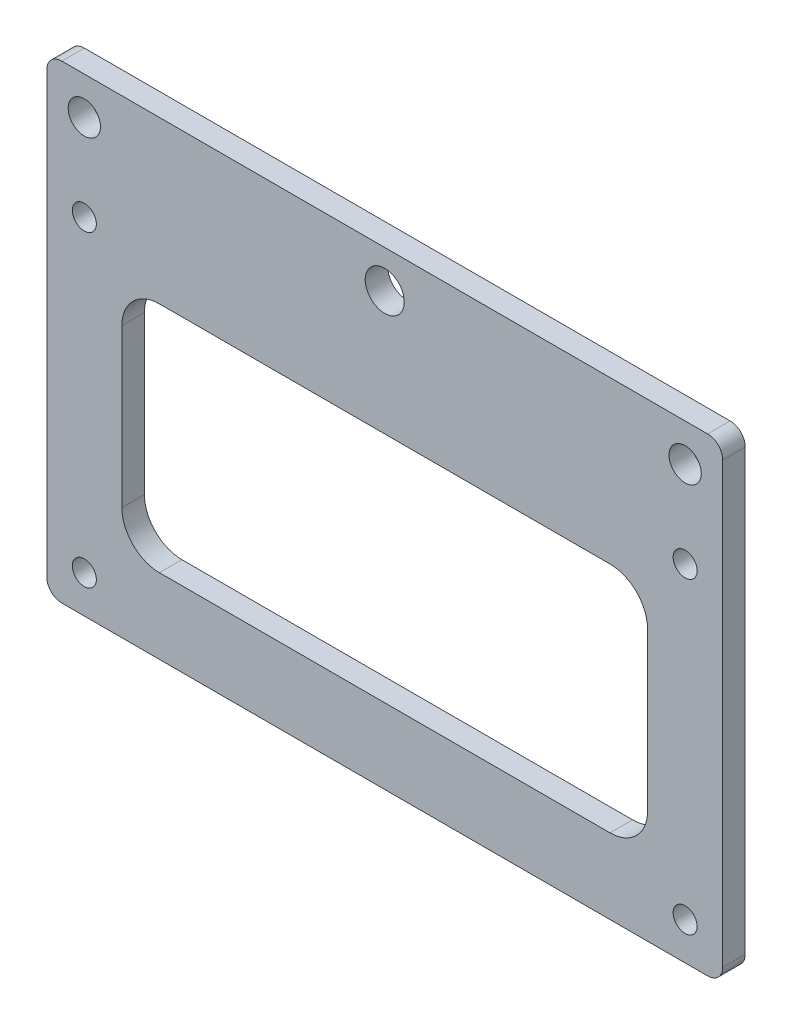
ISO-10303-21;
HEADER;
FILE_DESCRIPTION(('STEP AP214'),'2;1');
FILE_NAME('part.step','',(''),(''),'','','');
FILE_SCHEMA(('AUTOMOTIVE_DESIGN { 1 0 10303 214 1 1 1 1 }'));
ENDSEC;
DATA;
#1=APPLICATION_CONTEXT('core data for automotive mechanical design processes');
#2=APPLICATION_PROTOCOL_DEFINITION('international standard','automotive_design',2000,#1);
#3=PRODUCT_CONTEXT('',#1,'mechanical');
#4=PRODUCT('Part','Part','',(#3));
#5=PRODUCT_RELATED_PRODUCT_CATEGORY('part','',(#4));
#6=PRODUCT_DEFINITION_FORMATION('','',#4);
#7=PRODUCT_DEFINITION_CONTEXT('part definition',#1,'design');
#8=PRODUCT_DEFINITION('design','',#6,#7);
#9=PRODUCT_DEFINITION_SHAPE('','',#8);
#10=(LENGTH_UNIT() NAMED_UNIT(*) SI_UNIT(.MILLI.,.METRE.));
#11=(NAMED_UNIT(*) PLANE_ANGLE_UNIT() SI_UNIT($,.RADIAN.));
#12=(NAMED_UNIT(*) SI_UNIT($,.STERADIAN.) SOLID_ANGLE_UNIT());
#13=UNCERTAINTY_MEASURE_WITH_UNIT(LENGTH_MEASURE(1.E-05),#10,'distance_accuracy_value','');
#14=(GEOMETRIC_REPRESENTATION_CONTEXT(3) GLOBAL_UNCERTAINTY_ASSIGNED_CONTEXT((#13)) GLOBAL_UNIT_ASSIGNED_CONTEXT((#10,
#11,#12)) REPRESENTATION_CONTEXT('',''));
#15=CARTESIAN_POINT('',(0.,0.,0.));
#16=DIRECTION('',(0.,0.,1.));
#17=DIRECTION('',(1.,0.,0.));
#18=AXIS2_PLACEMENT_3D('',#15,#16,#17);
#19=CARTESIAN_POINT('',(0.,0.,3.));
#20=DIRECTION('',(0.,0.,1.));
#21=DIRECTION('',(1.,0.,0.));
#22=AXIS2_PLACEMENT_3D('',#19,#20,#21);
#23=PLANE('',#22);
#24=DIRECTION('',(1.,0.,0.));
#25=VECTOR('',#24,1.);
#26=CARTESIAN_POINT('',(35.,-15.5,3.));
#27=LINE('',#26,#25);
#28=CARTESIAN_POINT('',(-30.,-15.5,3.));
#29=VERTEX_POINT('',#28);
#30=CARTESIAN_POINT('',(30.,-15.5,3.));
#31=VERTEX_POINT('',#30);
#32=EDGE_CURVE('E372',#29,#31,#27,.T.);
#33=ORIENTED_EDGE('',*,*,#32,.F.);
#34=CARTESIAN_POINT('',(-30.,-10.5,3.));
#35=DIRECTION('',(0.,0.,1.));
#36=DIRECTION('',(1.,0.,0.));
#37=AXIS2_PLACEMENT_3D('',#34,#35,#36);
#38=CIRCLE('',#37,5.);
#39=CARTESIAN_POINT('',(-35.,-10.5,3.));
#40=VERTEX_POINT('',#39);
#41=EDGE_CURVE('E208',#29,#40,#38,.F.);
#42=ORIENTED_EDGE('',*,*,#41,.T.);
#43=DIRECTION('',(0.,-1.,0.));
#44=VECTOR('',#43,1.);
#45=CARTESIAN_POINT('',(-35.,15.5,3.));
#46=LINE('',#45,#44);
#47=CARTESIAN_POINT('',(-35.,10.5,3.));
#48=VERTEX_POINT('',#47);
#49=EDGE_CURVE('E369',#48,#40,#46,.T.);
#50=ORIENTED_EDGE('',*,*,#49,.F.);
#51=CARTESIAN_POINT('',(-30.,10.5,3.));
#52=DIRECTION('',(0.,0.,1.));
#53=DIRECTION('',(1.,0.,0.));
#54=AXIS2_PLACEMENT_3D('',#51,#52,#53);
#55=CIRCLE('',#54,5.);
#56=CARTESIAN_POINT('',(-30.,15.5,3.));
#57=VERTEX_POINT('',#56);
#58=EDGE_CURVE('E212',#48,#57,#55,.F.);
#59=ORIENTED_EDGE('',*,*,#58,.T.);
#60=DIRECTION('',(-1.,0.,0.));
#61=VECTOR('',#60,1.);
#62=CARTESIAN_POINT('',(35.,15.5,3.));
#63=LINE('',#62,#61);
#64=CARTESIAN_POINT('',(30.,15.5,3.));
#65=VERTEX_POINT('',#64);
#66=EDGE_CURVE('E377',#65,#57,#63,.T.);
#67=ORIENTED_EDGE('',*,*,#66,.F.);
#68=CARTESIAN_POINT('',(30.,10.5,3.));
#69=DIRECTION('',(0.,0.,1.));
#70=DIRECTION('',(1.,0.,0.));
#71=AXIS2_PLACEMENT_3D('',#68,#69,#70);
#72=CIRCLE('',#71,5.);
#73=CARTESIAN_POINT('',(35.,10.5,3.));
#74=VERTEX_POINT('',#73);
#75=EDGE_CURVE('E164',#65,#74,#72,.F.);
#76=ORIENTED_EDGE('',*,*,#75,.T.);
#77=DIRECTION('',(0.,1.,0.));
#78=VECTOR('',#77,1.);
#79=CARTESIAN_POINT('',(35.,15.5,3.));
#80=LINE('',#79,#78);
#81=CARTESIAN_POINT('',(35.,-10.5,3.));
#82=VERTEX_POINT('',#81);
#83=EDGE_CURVE('E375',#82,#74,#80,.T.);
#84=ORIENTED_EDGE('',*,*,#83,.F.);
#85=CARTESIAN_POINT('',(30.,-10.5,3.));
#86=DIRECTION('',(0.,0.,1.));
#87=DIRECTION('',(1.,0.,0.));
#88=AXIS2_PLACEMENT_3D('',#85,#86,#87);
#89=CIRCLE('',#88,5.);
#90=EDGE_CURVE('E163',#82,#31,#89,.F.);
#91=ORIENTED_EDGE('',*,*,#90,.T.);
#92=EDGE_LOOP('',(#33,#42,#50,#59,#67,#76,#84,#91));
#93=FACE_BOUND('',#92,.T.);
#94=CARTESIAN_POINT('',(-40.,-20.5,3.));
#95=DIRECTION('',(0.,0.,1.));
#96=DIRECTION('',(1.,0.,0.));
#97=AXIS2_PLACEMENT_3D('',#94,#95,#96);
#98=CIRCLE('',#97,1.60000000000002);
#99=CARTESIAN_POINT('',(-38.4,-20.5,3.));
#100=VERTEX_POINT('',#99);
#101=EDGE_CURVE('E385',#100,#100,#98,.T.);
#102=ORIENTED_EDGE('',*,*,#101,.F.);
#103=EDGE_LOOP('',(#102));
#104=FACE_BOUND('',#103,.T.);
#105=CARTESIAN_POINT('',(40.,-20.5,3.));
#106=DIRECTION('',(0.,0.,1.));
#107=DIRECTION('',(-1.,0.,0.));
#108=AXIS2_PLACEMENT_3D('',#105,#106,#107);
#109=CIRCLE('',#108,1.6);
#110=CARTESIAN_POINT('',(38.4,-20.5,3.));
#111=VERTEX_POINT('',#110);
#112=EDGE_CURVE('E397',#111,#111,#109,.T.);
#113=ORIENTED_EDGE('',*,*,#112,.F.);
#114=EDGE_LOOP('',(#113));
#115=FACE_BOUND('',#114,.T.);
#116=CARTESIAN_POINT('',(40.,32.,3.));
#117=DIRECTION('',(0.,0.,1.));
#118=DIRECTION('',(1.,0.,0.));
#119=AXIS2_PLACEMENT_3D('',#116,#117,#118);
#120=CIRCLE('',#119,2.15);
#121=CARTESIAN_POINT('',(42.15,32.,3.));
#122=VERTEX_POINT('',#121);
#123=EDGE_CURVE('E409',#122,#122,#120,.T.);
#124=ORIENTED_EDGE('',*,*,#123,.F.);
#125=EDGE_LOOP('',(#124));
#126=FACE_BOUND('',#125,.T.);
#127=DIRECTION('',(0.,-1.,0.));
#128=VECTOR('',#127,1.);
#129=CARTESIAN_POINT('',(-45.,37.,3.));
#130=LINE('',#129,#128);
#131=CARTESIAN_POINT('',(-45.,35.,3.));
#132=VERTEX_POINT('',#131);
#133=CARTESIAN_POINT('',(-45.,-23.5,3.));
#134=VERTEX_POINT('',#133);
#135=EDGE_CURVE('E183',#132,#134,#130,.T.);
#136=ORIENTED_EDGE('',*,*,#135,.T.);
#137=CARTESIAN_POINT('',(-43.,-23.5,3.));
#138=DIRECTION('',(0.,0.,1.));
#139=DIRECTION('',(1.,0.,0.));
#140=AXIS2_PLACEMENT_3D('',#137,#138,#139);
#141=CIRCLE('',#140,2.);
#142=CARTESIAN_POINT('',(-43.,-25.5,3.));
#143=VERTEX_POINT('',#142);
#144=EDGE_CURVE('E237',#134,#143,#141,.T.);
#145=ORIENTED_EDGE('',*,*,#144,.T.);
#146=DIRECTION('',(1.,0.,0.));
#147=VECTOR('',#146,1.);
#148=CARTESIAN_POINT('',(-45.,-25.5,3.));
#149=LINE('',#148,#147);
#150=CARTESIAN_POINT('',(43.,-25.5,3.));
#151=VERTEX_POINT('',#150);
#152=EDGE_CURVE('E178',#143,#151,#149,.T.);
#153=ORIENTED_EDGE('',*,*,#152,.T.);
#154=CARTESIAN_POINT('',(43.,-23.5,3.));
#155=DIRECTION('',(0.,0.,1.));
#156=DIRECTION('',(1.,0.,0.));
#157=AXIS2_PLACEMENT_3D('',#154,#155,#156);
#158=CIRCLE('',#157,2.);
#159=CARTESIAN_POINT('',(45.,-23.5,3.));
#160=VERTEX_POINT('',#159);
#161=EDGE_CURVE('E235',#151,#160,#158,.T.);
#162=ORIENTED_EDGE('',*,*,#161,.T.);
#163=DIRECTION('',(0.,1.,0.));
#164=VECTOR('',#163,1.);
#165=CARTESIAN_POINT('',(45.,37.,3.));
#166=LINE('',#165,#164);
#167=CARTESIAN_POINT('',(45.,35.,3.));
#168=VERTEX_POINT('',#167);
#169=EDGE_CURVE('E251',#160,#168,#166,.T.);
#170=ORIENTED_EDGE('',*,*,#169,.T.);
#171=CARTESIAN_POINT('',(43.,35.,3.));
#172=DIRECTION('',(0.,0.,1.));
#173=DIRECTION('',(1.,0.,0.));
#174=AXIS2_PLACEMENT_3D('',#171,#172,#173);
#175=CIRCLE('',#174,2.);
#176=CARTESIAN_POINT('',(43.,37.,3.));
#177=VERTEX_POINT('',#176);
#178=EDGE_CURVE('E58',#168,#177,#175,.T.);
#179=ORIENTED_EDGE('',*,*,#178,.T.);
#180=DIRECTION('',(-1.,0.,0.));
#181=VECTOR('',#180,1.);
#182=CARTESIAN_POINT('',(-45.,37.,3.));
#183=LINE('',#182,#181);
#184=CARTESIAN_POINT('',(-43.,37.,3.));
#185=VERTEX_POINT('',#184);
#186=EDGE_CURVE('E273',#177,#185,#183,.T.);
#187=ORIENTED_EDGE('',*,*,#186,.T.);
#188=CARTESIAN_POINT('',(-43.,35.,3.));
#189=DIRECTION('',(0.,0.,1.));
#190=DIRECTION('',(1.,0.,0.));
#191=AXIS2_PLACEMENT_3D('',#188,#189,#190);
#192=CIRCLE('',#191,2.);
#193=EDGE_CURVE('E232',#185,#132,#192,.T.);
#194=ORIENTED_EDGE('',*,*,#193,.T.);
#195=EDGE_LOOP('',(#136,#145,#153,#162,#170,#179,#187,#194));
#196=FACE_BOUND('',#195,.T.);
#197=CARTESIAN_POINT('',(40.,20.5,3.));
#198=DIRECTION('',(0.,0.,1.));
#199=DIRECTION('',(1.,0.,0.));
#200=AXIS2_PLACEMENT_3D('',#197,#198,#199);
#201=CIRCLE('',#200,1.6);
#202=CARTESIAN_POINT('',(41.6,20.5,3.));
#203=VERTEX_POINT('',#202);
#204=EDGE_CURVE('E259',#203,#203,#201,.T.);
#205=ORIENTED_EDGE('',*,*,#204,.F.);
#206=EDGE_LOOP('',(#205));
#207=FACE_BOUND('',#206,.T.);
#208=CARTESIAN_POINT('',(-40.,32.,3.));
#209=DIRECTION('',(0.,0.,1.));
#210=DIRECTION('',(-1.,0.,0.));
#211=AXIS2_PLACEMENT_3D('',#208,#209,#210);
#212=CIRCLE('',#211,2.15);
#213=CARTESIAN_POINT('',(-42.15,32.,3.));
#214=VERTEX_POINT('',#213);
#215=EDGE_CURVE('E403',#214,#214,#212,.T.);
#216=ORIENTED_EDGE('',*,*,#215,.F.);
#217=EDGE_LOOP('',(#216));
#218=FACE_BOUND('',#217,.T.);
#219=CARTESIAN_POINT('',(-40.,20.5,3.));
#220=DIRECTION('',(0.,0.,1.));
#221=DIRECTION('',(-1.,0.,0.));
#222=AXIS2_PLACEMENT_3D('',#219,#220,#221);
#223=CIRCLE('',#222,1.60000000000001);
#224=CARTESIAN_POINT('',(-41.6,20.5,3.));
#225=VERTEX_POINT('',#224);
#226=EDGE_CURVE('E391',#225,#225,#223,.T.);
#227=ORIENTED_EDGE('',*,*,#226,.F.);
#228=EDGE_LOOP('',(#227));
#229=FACE_BOUND('',#228,.T.);
#230=CARTESIAN_POINT('',(0.,32.,3.));
#231=DIRECTION('',(0.,0.,1.));
#232=DIRECTION('',(1.,0.,0.));
#233=AXIS2_PLACEMENT_3D('',#230,#231,#232);
#234=CIRCLE('',#233,2.6);
#235=CARTESIAN_POINT('',(2.6,32.,3.));
#236=VERTEX_POINT('',#235);
#237=EDGE_CURVE('E361',#236,#236,#234,.T.);
#238=ORIENTED_EDGE('',*,*,#237,.F.);
#239=EDGE_LOOP('',(#238));
#240=FACE_BOUND('',#239,.T.);
#241=ADVANCED_FACE('F37',(#93,#104,#115,#126,#196,#207,#218,#229,#240),#23,.T.);
#242=CARTESIAN_POINT('',(0.,0.,0.));
#243=DIRECTION('',(0.,0.,1.));
#244=DIRECTION('',(1.,0.,0.));
#245=AXIS2_PLACEMENT_3D('',#242,#243,#244);
#246=PLANE('',#245);
#247=CARTESIAN_POINT('',(-40.,-20.5,0.));
#248=DIRECTION('',(0.,0.,1.));
#249=DIRECTION('',(1.,0.,0.));
#250=AXIS2_PLACEMENT_3D('',#247,#248,#249);
#251=CIRCLE('',#250,1.60000000000002);
#252=CARTESIAN_POINT('',(-38.4,-20.5,0.));
#253=VERTEX_POINT('',#252);
#254=EDGE_CURVE('E380',#253,#253,#251,.T.);
#255=ORIENTED_EDGE('',*,*,#254,.T.);
#256=EDGE_LOOP('',(#255));
#257=FACE_BOUND('',#256,.T.);
#258=CARTESIAN_POINT('',(-40.,20.5,0.));
#259=DIRECTION('',(0.,0.,1.));
#260=DIRECTION('',(-1.,0.,0.));
#261=AXIS2_PLACEMENT_3D('',#258,#259,#260);
#262=CIRCLE('',#261,1.60000000000001);
#263=CARTESIAN_POINT('',(-41.6,20.5,0.));
#264=VERTEX_POINT('',#263);
#265=EDGE_CURVE('E388',#264,#264,#262,.T.);
#266=ORIENTED_EDGE('',*,*,#265,.T.);
#267=EDGE_LOOP('',(#266));
#268=FACE_BOUND('',#267,.T.);
#269=CARTESIAN_POINT('',(40.,-20.5,0.));
#270=DIRECTION('',(0.,0.,1.));
#271=DIRECTION('',(-1.,0.,0.));
#272=AXIS2_PLACEMENT_3D('',#269,#270,#271);
#273=CIRCLE('',#272,1.6);
#274=CARTESIAN_POINT('',(38.4,-20.5,0.));
#275=VERTEX_POINT('',#274);
#276=EDGE_CURVE('E394',#275,#275,#273,.T.);
#277=ORIENTED_EDGE('',*,*,#276,.T.);
#278=EDGE_LOOP('',(#277));
#279=FACE_BOUND('',#278,.T.);
#280=CARTESIAN_POINT('',(-40.,32.,0.));
#281=DIRECTION('',(0.,0.,1.));
#282=DIRECTION('',(-1.,0.,0.));
#283=AXIS2_PLACEMENT_3D('',#280,#281,#282);
#284=CIRCLE('',#283,2.15);
#285=CARTESIAN_POINT('',(-42.15,32.,0.));
#286=VERTEX_POINT('',#285);
#287=EDGE_CURVE('E400',#286,#286,#284,.T.);
#288=ORIENTED_EDGE('',*,*,#287,.T.);
#289=EDGE_LOOP('',(#288));
#290=FACE_BOUND('',#289,.T.);
#291=CARTESIAN_POINT('',(40.,32.,0.));
#292=DIRECTION('',(0.,0.,1.));
#293=DIRECTION('',(1.,0.,0.));
#294=AXIS2_PLACEMENT_3D('',#291,#292,#293);
#295=CIRCLE('',#294,2.15);
#296=CARTESIAN_POINT('',(42.15,32.,0.));
#297=VERTEX_POINT('',#296);
#298=EDGE_CURVE('E406',#297,#297,#295,.T.);
#299=ORIENTED_EDGE('',*,*,#298,.T.);
#300=EDGE_LOOP('',(#299));
#301=FACE_BOUND('',#300,.T.);
#302=CARTESIAN_POINT('',(40.,20.5,0.));
#303=DIRECTION('',(0.,0.,1.));
#304=DIRECTION('',(1.,0.,0.));
#305=AXIS2_PLACEMENT_3D('',#302,#303,#304);
#306=CIRCLE('',#305,1.6);
#307=CARTESIAN_POINT('',(41.6,20.5,0.));
#308=VERTEX_POINT('',#307);
#309=EDGE_CURVE('E264',#308,#308,#306,.T.);
#310=ORIENTED_EDGE('',*,*,#309,.T.);
#311=EDGE_LOOP('',(#310));
#312=FACE_BOUND('',#311,.T.);
#313=DIRECTION('',(1.,0.,0.));
#314=VECTOR('',#313,1.);
#315=CARTESIAN_POINT('',(-45.,-25.5,0.));
#316=LINE('',#315,#314);
#317=CARTESIAN_POINT('',(-43.,-25.5,0.));
#318=VERTEX_POINT('',#317);
#319=CARTESIAN_POINT('',(43.,-25.5,0.));
#320=VERTEX_POINT('',#319);
#321=EDGE_CURVE('E186',#318,#320,#316,.T.);
#322=ORIENTED_EDGE('',*,*,#321,.F.);
#323=CARTESIAN_POINT('',(-43.,-23.5,0.));
#324=DIRECTION('',(0.,0.,1.));
#325=DIRECTION('',(1.,0.,0.));
#326=AXIS2_PLACEMENT_3D('',#323,#324,#325);
#327=CIRCLE('',#326,2.);
#328=CARTESIAN_POINT('',(-45.,-23.5,0.));
#329=VERTEX_POINT('',#328);
#330=EDGE_CURVE('E225',#318,#329,#327,.F.);
#331=ORIENTED_EDGE('',*,*,#330,.T.);
#332=DIRECTION('',(0.,-1.,0.));
#333=VECTOR('',#332,1.);
#334=CARTESIAN_POINT('',(-45.,37.,0.));
#335=LINE('',#334,#333);
#336=CARTESIAN_POINT('',(-45.,35.,0.));
#337=VERTEX_POINT('',#336);
#338=EDGE_CURVE('E261',#337,#329,#335,.T.);
#339=ORIENTED_EDGE('',*,*,#338,.F.);
#340=CARTESIAN_POINT('',(-43.,35.,0.));
#341=DIRECTION('',(0.,0.,1.));
#342=DIRECTION('',(1.,0.,0.));
#343=AXIS2_PLACEMENT_3D('',#340,#341,#342);
#344=CIRCLE('',#343,2.);
#345=CARTESIAN_POINT('',(-43.,37.,0.));
#346=VERTEX_POINT('',#345);
#347=EDGE_CURVE('E219',#337,#346,#344,.F.);
#348=ORIENTED_EDGE('',*,*,#347,.T.);
#349=DIRECTION('',(-1.,0.,0.));
#350=VECTOR('',#349,1.);
#351=CARTESIAN_POINT('',(-45.,37.,0.));
#352=LINE('',#351,#350);
#353=CARTESIAN_POINT('',(43.,37.,0.));
#354=VERTEX_POINT('',#353);
#355=EDGE_CURVE('E258',#354,#346,#352,.T.);
#356=ORIENTED_EDGE('',*,*,#355,.F.);
#357=CARTESIAN_POINT('',(43.,35.,0.));
#358=DIRECTION('',(0.,0.,1.));
#359=DIRECTION('',(1.,0.,0.));
#360=AXIS2_PLACEMENT_3D('',#357,#358,#359);
#361=CIRCLE('',#360,2.);
#362=CARTESIAN_POINT('',(45.,35.,0.));
#363=VERTEX_POINT('',#362);
#364=EDGE_CURVE('E221',#354,#363,#361,.F.);
#365=ORIENTED_EDGE('',*,*,#364,.T.);
#366=DIRECTION('',(0.,1.,0.));
#367=VECTOR('',#366,1.);
#368=CARTESIAN_POINT('',(45.,37.,0.));
#369=LINE('',#368,#367);
#370=CARTESIAN_POINT('',(45.,-23.5,0.));
#371=VERTEX_POINT('',#370);
#372=EDGE_CURVE('E249',#371,#363,#369,.T.);
#373=ORIENTED_EDGE('',*,*,#372,.F.);
#374=CARTESIAN_POINT('',(43.,-23.5,0.));
#375=DIRECTION('',(0.,0.,1.));
#376=DIRECTION('',(1.,0.,0.));
#377=AXIS2_PLACEMENT_3D('',#374,#375,#376);
#378=CIRCLE('',#377,2.);
#379=EDGE_CURVE('E223',#371,#320,#378,.F.);
#380=ORIENTED_EDGE('',*,*,#379,.T.);
#381=EDGE_LOOP('',(#322,#331,#339,#348,#356,#365,#373,#380));
#382=FACE_BOUND('',#381,.T.);
#383=DIRECTION('',(-1.,0.,0.));
#384=VECTOR('',#383,1.);
#385=CARTESIAN_POINT('',(35.,15.5,0.));
#386=LINE('',#385,#384);
#387=CARTESIAN_POINT('',(30.,15.5,0.));
#388=VERTEX_POINT('',#387);
#389=CARTESIAN_POINT('',(-30.,15.5,0.));
#390=VERTEX_POINT('',#389);
#391=EDGE_CURVE('E174',#388,#390,#386,.T.);
#392=ORIENTED_EDGE('',*,*,#391,.T.);
#393=CARTESIAN_POINT('',(-30.,10.5,0.));
#394=DIRECTION('',(0.,0.,1.));
#395=DIRECTION('',(1.,0.,0.));
#396=AXIS2_PLACEMENT_3D('',#393,#394,#395);
#397=CIRCLE('',#396,5.);
#398=CARTESIAN_POINT('',(-35.,10.5,0.));
#399=VERTEX_POINT('',#398);
#400=EDGE_CURVE('E210',#390,#399,#397,.T.);
#401=ORIENTED_EDGE('',*,*,#400,.T.);
#402=DIRECTION('',(0.,-1.,0.));
#403=VECTOR('',#402,1.);
#404=CARTESIAN_POINT('',(-35.,15.5,0.));
#405=LINE('',#404,#403);
#406=CARTESIAN_POINT('',(-35.,-10.5,0.));
#407=VERTEX_POINT('',#406);
#408=EDGE_CURVE('E366',#399,#407,#405,.T.);
#409=ORIENTED_EDGE('',*,*,#408,.T.);
#410=CARTESIAN_POINT('',(-30.,-10.5,0.));
#411=DIRECTION('',(0.,0.,1.));
#412=DIRECTION('',(1.,0.,0.));
#413=AXIS2_PLACEMENT_3D('',#410,#411,#412);
#414=CIRCLE('',#413,5.);
#415=CARTESIAN_POINT('',(-30.,-15.5,0.));
#416=VERTEX_POINT('',#415);
#417=EDGE_CURVE('E206',#407,#416,#414,.T.);
#418=ORIENTED_EDGE('',*,*,#417,.T.);
#419=DIRECTION('',(1.,0.,0.));
#420=VECTOR('',#419,1.);
#421=CARTESIAN_POINT('',(35.,-15.5,0.));
#422=LINE('',#421,#420);
#423=CARTESIAN_POINT('',(30.,-15.5,0.));
#424=VERTEX_POINT('',#423);
#425=EDGE_CURVE('E158',#416,#424,#422,.T.);
#426=ORIENTED_EDGE('',*,*,#425,.T.);
#427=CARTESIAN_POINT('',(30.,-10.5,0.));
#428=DIRECTION('',(0.,0.,1.));
#429=DIRECTION('',(1.,0.,0.));
#430=AXIS2_PLACEMENT_3D('',#427,#428,#429);
#431=CIRCLE('',#430,5.);
#432=CARTESIAN_POINT('',(35.,-10.5,0.));
#433=VERTEX_POINT('',#432);
#434=EDGE_CURVE('E151',#424,#433,#431,.T.);
#435=ORIENTED_EDGE('',*,*,#434,.T.);
#436=DIRECTION('',(0.,1.,0.));
#437=VECTOR('',#436,1.);
#438=CARTESIAN_POINT('',(35.,15.5,0.));
#439=LINE('',#438,#437);
#440=CARTESIAN_POINT('',(35.,10.5,0.));
#441=VERTEX_POINT('',#440);
#442=EDGE_CURVE('E156',#433,#441,#439,.T.);
#443=ORIENTED_EDGE('',*,*,#442,.T.);
#444=CARTESIAN_POINT('',(30.,10.5,0.));
#445=DIRECTION('',(0.,0.,1.));
#446=DIRECTION('',(1.,0.,0.));
#447=AXIS2_PLACEMENT_3D('',#444,#445,#446);
#448=CIRCLE('',#447,5.);
#449=EDGE_CURVE('E202',#441,#388,#448,.T.);
#450=ORIENTED_EDGE('',*,*,#449,.T.);
#451=EDGE_LOOP('',(#392,#401,#409,#418,#426,#435,#443,#450));
#452=FACE_BOUND('',#451,.T.);
#453=CARTESIAN_POINT('',(0.,32.,0.));
#454=DIRECTION('',(0.,0.,1.));
#455=DIRECTION('',(1.,0.,0.));
#456=AXIS2_PLACEMENT_3D('',#453,#454,#455);
#457=CIRCLE('',#456,2.6);
#458=CARTESIAN_POINT('',(2.6,32.,0.));
#459=VERTEX_POINT('',#458);
#460=EDGE_CURVE('E364',#459,#459,#457,.T.);
#461=ORIENTED_EDGE('',*,*,#460,.T.);
#462=EDGE_LOOP('',(#461));
#463=FACE_BOUND('',#462,.T.);
#464=ADVANCED_FACE('F154',(#257,#268,#279,#290,#301,#312,#382,#452,#463),#246,.F.);
#465=CARTESIAN_POINT('',(45.,37.,3.));
#466=DIRECTION('',(-1.,0.,0.));
#467=DIRECTION('',(0.,-1.,0.));
#468=AXIS2_PLACEMENT_3D('',#465,#466,#467);
#469=PLANE('',#468);
#470=ORIENTED_EDGE('',*,*,#169,.F.);
#471=DIRECTION('',(0.,0.,-1.));
#472=VECTOR('',#471,1.);
#473=CARTESIAN_POINT('',(45.,-23.5,3.));
#474=LINE('',#473,#472);
#475=EDGE_CURVE('E241',#160,#371,#474,.T.);
#476=ORIENTED_EDGE('',*,*,#475,.T.);
#477=ORIENTED_EDGE('',*,*,#372,.T.);
#478=DIRECTION('',(0.,0.,-1.));
#479=VECTOR('',#478,1.);
#480=CARTESIAN_POINT('',(45.,35.,3.));
#481=LINE('',#480,#479);
#482=EDGE_CURVE('E239',#363,#168,#481,.F.);
#483=ORIENTED_EDGE('',*,*,#482,.T.);
#484=EDGE_LOOP('',(#470,#476,#477,#483));
#485=FACE_BOUND('',#484,.T.);
#486=ADVANCED_FACE('F248',(#485),#469,.F.);
#487=CARTESIAN_POINT('',(-45.,37.,3.));
#488=DIRECTION('',(0.,-1.,0.));
#489=DIRECTION('',(0.,0.,-1.));
#490=AXIS2_PLACEMENT_3D('',#487,#488,#489);
#491=PLANE('',#490);
#492=ORIENTED_EDGE('',*,*,#186,.F.);
#493=DIRECTION('',(0.,0.,-1.));
#494=VECTOR('',#493,1.);
#495=CARTESIAN_POINT('',(43.,37.,3.));
#496=LINE('',#495,#494);
#497=EDGE_CURVE('E11',#177,#354,#496,.T.);
#498=ORIENTED_EDGE('',*,*,#497,.T.);
#499=ORIENTED_EDGE('',*,*,#355,.T.);
#500=DIRECTION('',(0.,0.,-1.));
#501=VECTOR('',#500,1.);
#502=CARTESIAN_POINT('',(-43.,37.,3.));
#503=LINE('',#502,#501);
#504=EDGE_CURVE('E45',#346,#185,#503,.F.);
#505=ORIENTED_EDGE('',*,*,#504,.T.);
#506=EDGE_LOOP('',(#492,#498,#499,#505));
#507=FACE_BOUND('',#506,.T.);
#508=ADVANCED_FACE('F289',(#507),#491,.F.);
#509=CARTESIAN_POINT('',(-45.,37.,3.));
#510=DIRECTION('',(1.,0.,0.));
#511=DIRECTION('',(0.,1.,0.));
#512=AXIS2_PLACEMENT_3D('',#509,#510,#511);
#513=PLANE('',#512);
#514=ORIENTED_EDGE('',*,*,#338,.T.);
#515=DIRECTION('',(0.,0.,-1.));
#516=VECTOR('',#515,1.);
#517=CARTESIAN_POINT('',(-45.,-23.5,3.));
#518=LINE('',#517,#516);
#519=EDGE_CURVE('E230',#329,#134,#518,.F.);
#520=ORIENTED_EDGE('',*,*,#519,.T.);
#521=ORIENTED_EDGE('',*,*,#135,.F.);
#522=DIRECTION('',(0.,0.,-1.));
#523=VECTOR('',#522,1.);
#524=CARTESIAN_POINT('',(-45.,35.,3.));
#525=LINE('',#524,#523);
#526=EDGE_CURVE('E227',#132,#337,#525,.T.);
#527=ORIENTED_EDGE('',*,*,#526,.T.);
#528=EDGE_LOOP('',(#514,#520,#521,#527));
#529=FACE_BOUND('',#528,.T.);
#530=ADVANCED_FACE('F291',(#529),#513,.F.);
#531=CARTESIAN_POINT('',(-45.,-25.5,3.));
#532=DIRECTION('',(0.,1.,0.));
#533=DIRECTION('',(0.,0.,1.));
#534=AXIS2_PLACEMENT_3D('',#531,#532,#533);
#535=PLANE('',#534);
#536=ORIENTED_EDGE('',*,*,#152,.F.);
#537=DIRECTION('',(0.,0.,-1.));
#538=VECTOR('',#537,1.);
#539=CARTESIAN_POINT('',(-43.,-25.5,3.));
#540=LINE('',#539,#538);
#541=EDGE_CURVE('E216',#143,#318,#540,.T.);
#542=ORIENTED_EDGE('',*,*,#541,.T.);
#543=ORIENTED_EDGE('',*,*,#321,.T.);
#544=DIRECTION('',(0.,0.,-1.));
#545=VECTOR('',#544,1.);
#546=CARTESIAN_POINT('',(43.,-25.5,3.));
#547=LINE('',#546,#545);
#548=EDGE_CURVE('E214',#320,#151,#547,.F.);
#549=ORIENTED_EDGE('',*,*,#548,.T.);
#550=EDGE_LOOP('',(#536,#542,#543,#549));
#551=FACE_BOUND('',#550,.T.);
#552=ADVANCED_FACE('F287',(#551),#535,.F.);
#553=CARTESIAN_POINT('',(40.,20.5,3.));
#554=DIRECTION('',(0.,0.,-1.));
#555=DIRECTION('',(-1.,0.,0.));
#556=AXIS2_PLACEMENT_3D('',#553,#554,#555);
#557=CYLINDRICAL_SURFACE('',#556,1.6);
#558=ORIENTED_EDGE('',*,*,#204,.T.);
#559=EDGE_LOOP('',(#558));
#560=FACE_BOUND('',#559,.T.);
#561=ORIENTED_EDGE('',*,*,#309,.F.);
#562=EDGE_LOOP('',(#561));
#563=FACE_BOUND('',#562,.T.);
#564=ADVANCED_FACE('F298',(#560,#563),#557,.F.);
#565=CARTESIAN_POINT('',(40.,32.,3.));
#566=DIRECTION('',(0.,0.,-1.));
#567=DIRECTION('',(-1.,0.,0.));
#568=AXIS2_PLACEMENT_3D('',#565,#566,#567);
#569=CYLINDRICAL_SURFACE('',#568,2.15);
#570=ORIENTED_EDGE('',*,*,#123,.T.);
#571=EDGE_LOOP('',(#570));
#572=FACE_BOUND('',#571,.T.);
#573=ORIENTED_EDGE('',*,*,#298,.F.);
#574=EDGE_LOOP('',(#573));
#575=FACE_BOUND('',#574,.T.);
#576=ADVANCED_FACE('F314',(#572,#575),#569,.F.);
#577=CARTESIAN_POINT('',(-40.,32.,3.));
#578=DIRECTION('',(0.,0.,-1.));
#579=DIRECTION('',(-1.,0.,0.));
#580=AXIS2_PLACEMENT_3D('',#577,#578,#579);
#581=CYLINDRICAL_SURFACE('',#580,2.15);
#582=ORIENTED_EDGE('',*,*,#215,.T.);
#583=EDGE_LOOP('',(#582));
#584=FACE_BOUND('',#583,.T.);
#585=ORIENTED_EDGE('',*,*,#287,.F.);
#586=EDGE_LOOP('',(#585));
#587=FACE_BOUND('',#586,.T.);
#588=ADVANCED_FACE('F318',(#584,#587),#581,.F.);
#589=CARTESIAN_POINT('',(40.,-20.5,3.));
#590=DIRECTION('',(0.,0.,-1.));
#591=DIRECTION('',(-1.,0.,0.));
#592=AXIS2_PLACEMENT_3D('',#589,#590,#591);
#593=CYLINDRICAL_SURFACE('',#592,1.6);
#594=ORIENTED_EDGE('',*,*,#112,.T.);
#595=EDGE_LOOP('',(#594));
#596=FACE_BOUND('',#595,.T.);
#597=ORIENTED_EDGE('',*,*,#276,.F.);
#598=EDGE_LOOP('',(#597));
#599=FACE_BOUND('',#598,.T.);
#600=ADVANCED_FACE('F322',(#596,#599),#593,.F.);
#601=CARTESIAN_POINT('',(-40.,20.5,3.));
#602=DIRECTION('',(0.,0.,-1.));
#603=DIRECTION('',(-1.,0.,0.));
#604=AXIS2_PLACEMENT_3D('',#601,#602,#603);
#605=CYLINDRICAL_SURFACE('',#604,1.60000000000001);
#606=ORIENTED_EDGE('',*,*,#226,.T.);
#607=EDGE_LOOP('',(#606));
#608=FACE_BOUND('',#607,.T.);
#609=ORIENTED_EDGE('',*,*,#265,.F.);
#610=EDGE_LOOP('',(#609));
#611=FACE_BOUND('',#610,.T.);
#612=ADVANCED_FACE('F326',(#608,#611),#605,.F.);
#613=CARTESIAN_POINT('',(-40.,-20.5,3.));
#614=DIRECTION('',(0.,0.,-1.));
#615=DIRECTION('',(-1.,0.,0.));
#616=AXIS2_PLACEMENT_3D('',#613,#614,#615);
#617=CYLINDRICAL_SURFACE('',#616,1.60000000000002);
#618=ORIENTED_EDGE('',*,*,#101,.T.);
#619=EDGE_LOOP('',(#618));
#620=FACE_BOUND('',#619,.T.);
#621=ORIENTED_EDGE('',*,*,#254,.F.);
#622=EDGE_LOOP('',(#621));
#623=FACE_BOUND('',#622,.T.);
#624=ADVANCED_FACE('F330',(#620,#623),#617,.F.);
#625=CARTESIAN_POINT('',(-35.,15.5,3.));
#626=DIRECTION('',(1.,0.,0.));
#627=DIRECTION('',(0.,0.,-1.));
#628=AXIS2_PLACEMENT_3D('',#625,#626,#627);
#629=PLANE('',#628);
#630=ORIENTED_EDGE('',*,*,#49,.T.);
#631=DIRECTION('',(0.,0.,-1.));
#632=VECTOR('',#631,1.);
#633=CARTESIAN_POINT('',(-35.,-10.5,0.));
#634=LINE('',#633,#632);
#635=EDGE_CURVE('E199',#40,#407,#634,.T.);
#636=ORIENTED_EDGE('',*,*,#635,.T.);
#637=ORIENTED_EDGE('',*,*,#408,.F.);
#638=DIRECTION('',(0.,0.,-1.));
#639=VECTOR('',#638,1.);
#640=CARTESIAN_POINT('',(-35.,10.5,3.));
#641=LINE('',#640,#639);
#642=EDGE_CURVE('E197',#399,#48,#641,.F.);
#643=ORIENTED_EDGE('',*,*,#642,.T.);
#644=EDGE_LOOP('',(#630,#636,#637,#643));
#645=FACE_BOUND('',#644,.T.);
#646=ADVANCED_FACE('F334',(#645),#629,.T.);
#647=CARTESIAN_POINT('',(35.,-15.5,3.));
#648=DIRECTION('',(0.,1.,0.));
#649=DIRECTION('',(0.,0.,1.));
#650=AXIS2_PLACEMENT_3D('',#647,#648,#649);
#651=PLANE('',#650);
#652=ORIENTED_EDGE('',*,*,#32,.T.);
#653=DIRECTION('',(0.,0.,-1.));
#654=VECTOR('',#653,1.);
#655=CARTESIAN_POINT('',(30.,-15.5,0.));
#656=LINE('',#655,#654);
#657=EDGE_CURVE('E195',#31,#424,#656,.T.);
#658=ORIENTED_EDGE('',*,*,#657,.T.);
#659=ORIENTED_EDGE('',*,*,#425,.F.);
#660=DIRECTION('',(0.,0.,-1.));
#661=VECTOR('',#660,1.);
#662=CARTESIAN_POINT('',(-30.,-15.5,3.));
#663=LINE('',#662,#661);
#664=EDGE_CURVE('E193',#416,#29,#663,.F.);
#665=ORIENTED_EDGE('',*,*,#664,.T.);
#666=EDGE_LOOP('',(#652,#658,#659,#665));
#667=FACE_BOUND('',#666,.T.);
#668=ADVANCED_FACE('F338',(#667),#651,.T.);
#669=CARTESIAN_POINT('',(35.,15.5,3.));
#670=DIRECTION('',(-1.,0.,0.));
#671=DIRECTION('',(0.,0.,1.));
#672=AXIS2_PLACEMENT_3D('',#669,#670,#671);
#673=PLANE('',#672);
#674=ORIENTED_EDGE('',*,*,#83,.T.);
#675=DIRECTION('',(0.,0.,-1.));
#676=VECTOR('',#675,1.);
#677=CARTESIAN_POINT('',(35.,10.5,0.));
#678=LINE('',#677,#676);
#679=EDGE_CURVE('E173',#74,#441,#678,.T.);
#680=ORIENTED_EDGE('',*,*,#679,.T.);
#681=ORIENTED_EDGE('',*,*,#442,.F.);
#682=DIRECTION('',(0.,0.,-1.));
#683=VECTOR('',#682,1.);
#684=CARTESIAN_POINT('',(35.,-10.5,3.));
#685=LINE('',#684,#683);
#686=EDGE_CURVE('E170',#433,#82,#685,.F.);
#687=ORIENTED_EDGE('',*,*,#686,.T.);
#688=EDGE_LOOP('',(#674,#680,#681,#687));
#689=FACE_BOUND('',#688,.T.);
#690=ADVANCED_FACE('F169',(#689),#673,.T.);
#691=CARTESIAN_POINT('',(35.,15.5,3.));
#692=DIRECTION('',(0.,-1.,0.));
#693=DIRECTION('',(0.,0.,-1.));
#694=AXIS2_PLACEMENT_3D('',#691,#692,#693);
#695=PLANE('',#694);
#696=ORIENTED_EDGE('',*,*,#391,.F.);
#697=DIRECTION('',(0.,0.,-1.));
#698=VECTOR('',#697,1.);
#699=CARTESIAN_POINT('',(30.,15.5,3.));
#700=LINE('',#699,#698);
#701=EDGE_CURVE('E191',#388,#65,#700,.F.);
#702=ORIENTED_EDGE('',*,*,#701,.T.);
#703=ORIENTED_EDGE('',*,*,#66,.T.);
#704=DIRECTION('',(0.,0.,-1.));
#705=VECTOR('',#704,1.);
#706=CARTESIAN_POINT('',(-30.,15.5,0.));
#707=LINE('',#706,#705);
#708=EDGE_CURVE('E180',#57,#390,#707,.T.);
#709=ORIENTED_EDGE('',*,*,#708,.T.);
#710=EDGE_LOOP('',(#696,#702,#703,#709));
#711=FACE_BOUND('',#710,.T.);
#712=ADVANCED_FACE('F345',(#711),#695,.T.);
#713=CARTESIAN_POINT('',(0.,32.,3.));
#714=DIRECTION('',(0.,0.,-1.));
#715=DIRECTION('',(-1.,0.,0.));
#716=AXIS2_PLACEMENT_3D('',#713,#714,#715);
#717=CYLINDRICAL_SURFACE('',#716,2.6);
#718=ORIENTED_EDGE('',*,*,#237,.T.);
#719=EDGE_LOOP('',(#718));
#720=FACE_BOUND('',#719,.T.);
#721=ORIENTED_EDGE('',*,*,#460,.F.);
#722=EDGE_LOOP('',(#721));
#723=FACE_BOUND('',#722,.T.);
#724=ADVANCED_FACE('F348',(#720,#723),#717,.F.);
#725=CARTESIAN_POINT('',(30.,10.5,3.));
#726=DIRECTION('',(0.,0.,1.));
#727=DIRECTION('',(1.,0.,0.));
#728=AXIS2_PLACEMENT_3D('',#725,#726,#727);
#729=CYLINDRICAL_SURFACE('',#728,5.);
#730=ORIENTED_EDGE('',*,*,#75,.F.);
#731=ORIENTED_EDGE('',*,*,#701,.F.);
#732=ORIENTED_EDGE('',*,*,#449,.F.);
#733=ORIENTED_EDGE('',*,*,#679,.F.);
#734=EDGE_LOOP('',(#730,#731,#732,#733));
#735=FACE_BOUND('',#734,.T.);
#736=ADVANCED_FACE('F351',(#735),#729,.F.);
#737=CARTESIAN_POINT('',(30.,-10.5,3.));
#738=DIRECTION('',(0.,0.,1.));
#739=DIRECTION('',(1.,0.,0.));
#740=AXIS2_PLACEMENT_3D('',#737,#738,#739);
#741=CYLINDRICAL_SURFACE('',#740,5.);
#742=ORIENTED_EDGE('',*,*,#90,.F.);
#743=ORIENTED_EDGE('',*,*,#686,.F.);
#744=ORIENTED_EDGE('',*,*,#434,.F.);
#745=ORIENTED_EDGE('',*,*,#657,.F.);
#746=EDGE_LOOP('',(#742,#743,#744,#745));
#747=FACE_BOUND('',#746,.T.);
#748=ADVANCED_FACE('F177',(#747),#741,.F.);
#749=CARTESIAN_POINT('',(-30.,-10.5,3.));
#750=DIRECTION('',(0.,0.,1.));
#751=DIRECTION('',(1.,0.,0.));
#752=AXIS2_PLACEMENT_3D('',#749,#750,#751);
#753=CYLINDRICAL_SURFACE('',#752,5.);
#754=ORIENTED_EDGE('',*,*,#41,.F.);
#755=ORIENTED_EDGE('',*,*,#664,.F.);
#756=ORIENTED_EDGE('',*,*,#417,.F.);
#757=ORIENTED_EDGE('',*,*,#635,.F.);
#758=EDGE_LOOP('',(#754,#755,#756,#757));
#759=FACE_BOUND('',#758,.T.);
#760=ADVANCED_FACE('F456',(#759),#753,.F.);
#761=CARTESIAN_POINT('',(-30.,10.5,3.));
#762=DIRECTION('',(0.,0.,1.));
#763=DIRECTION('',(1.,0.,0.));
#764=AXIS2_PLACEMENT_3D('',#761,#762,#763);
#765=CYLINDRICAL_SURFACE('',#764,5.);
#766=ORIENTED_EDGE('',*,*,#58,.F.);
#767=ORIENTED_EDGE('',*,*,#642,.F.);
#768=ORIENTED_EDGE('',*,*,#400,.F.);
#769=ORIENTED_EDGE('',*,*,#708,.F.);
#770=EDGE_LOOP('',(#766,#767,#768,#769));
#771=FACE_BOUND('',#770,.T.);
#772=ADVANCED_FACE('F450',(#771),#765,.F.);
#773=CARTESIAN_POINT('',(-43.,-23.5,3.));
#774=DIRECTION('',(0.,0.,-1.));
#775=DIRECTION('',(-1.,0.,0.));
#776=AXIS2_PLACEMENT_3D('',#773,#774,#775);
#777=CYLINDRICAL_SURFACE('',#776,2.);
#778=ORIENTED_EDGE('',*,*,#144,.F.);
#779=ORIENTED_EDGE('',*,*,#519,.F.);
#780=ORIENTED_EDGE('',*,*,#330,.F.);
#781=ORIENTED_EDGE('',*,*,#541,.F.);
#782=EDGE_LOOP('',(#778,#779,#780,#781));
#783=FACE_BOUND('',#782,.T.);
#784=ADVANCED_FACE('F286',(#783),#777,.T.);
#785=CARTESIAN_POINT('',(43.,-23.5,3.));
#786=DIRECTION('',(0.,0.,-1.));
#787=DIRECTION('',(-1.,0.,0.));
#788=AXIS2_PLACEMENT_3D('',#785,#786,#787);
#789=CYLINDRICAL_SURFACE('',#788,2.);
#790=ORIENTED_EDGE('',*,*,#161,.F.);
#791=ORIENTED_EDGE('',*,*,#548,.F.);
#792=ORIENTED_EDGE('',*,*,#379,.F.);
#793=ORIENTED_EDGE('',*,*,#475,.F.);
#794=EDGE_LOOP('',(#790,#791,#792,#793));
#795=FACE_BOUND('',#794,.T.);
#796=ADVANCED_FACE('F468',(#795),#789,.T.);
#797=CARTESIAN_POINT('',(43.,35.,3.));
#798=DIRECTION('',(0.,0.,-1.));
#799=DIRECTION('',(-1.,0.,0.));
#800=AXIS2_PLACEMENT_3D('',#797,#798,#799);
#801=CYLINDRICAL_SURFACE('',#800,2.);
#802=ORIENTED_EDGE('',*,*,#178,.F.);
#803=ORIENTED_EDGE('',*,*,#482,.F.);
#804=ORIENTED_EDGE('',*,*,#364,.F.);
#805=ORIENTED_EDGE('',*,*,#497,.F.);
#806=EDGE_LOOP('',(#802,#803,#804,#805));
#807=FACE_BOUND('',#806,.T.);
#808=ADVANCED_FACE('F470',(#807),#801,.T.);
#809=CARTESIAN_POINT('',(-43.,35.,3.));
#810=DIRECTION('',(0.,0.,-1.));
#811=DIRECTION('',(-1.,0.,0.));
#812=AXIS2_PLACEMENT_3D('',#809,#810,#811);
#813=CYLINDRICAL_SURFACE('',#812,2.);
#814=ORIENTED_EDGE('',*,*,#193,.F.);
#815=ORIENTED_EDGE('',*,*,#504,.F.);
#816=ORIENTED_EDGE('',*,*,#347,.F.);
#817=ORIENTED_EDGE('',*,*,#526,.F.);
#818=EDGE_LOOP('',(#814,#815,#816,#817));
#819=FACE_BOUND('',#818,.T.);
#820=ADVANCED_FACE('F39',(#819),#813,.T.);
#821=CLOSED_SHELL('',(#241,#464,#486,#508,#530,#552,#564,#576,#588,#600,#612,#624,#646,#668,
#690,#712,#724,#736,#748,#760,#772,#784,#796,#808,#820));
#822=MANIFOLD_SOLID_BREP('B2',#821);
#823=ADVANCED_BREP_SHAPE_REPRESENTATION('',(#18,#822),#14);
#824=SHAPE_DEFINITION_REPRESENTATION(#9,#823);
ENDSEC;
END-ISO-10303-21;
